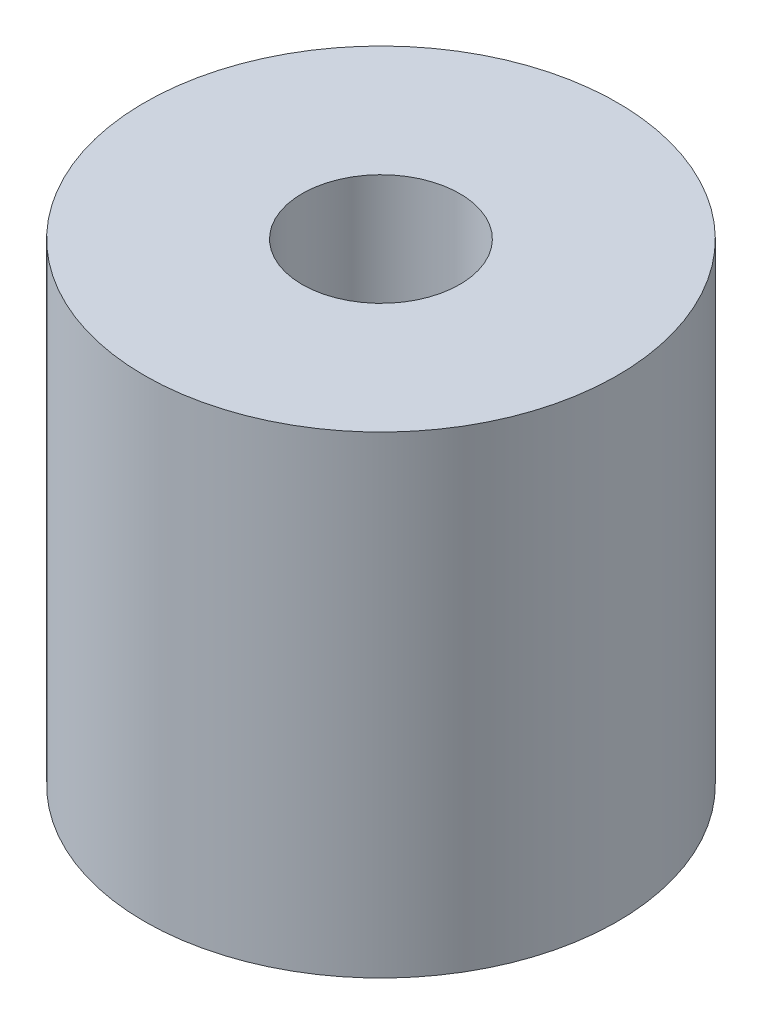
ISO-10303-21;
HEADER;
FILE_DESCRIPTION(('STEP AP214'),'2;1');
FILE_NAME('part.step','',(''),(''),'','','');
FILE_SCHEMA(('AUTOMOTIVE_DESIGN { 1 0 10303 214 1 1 1 1 }'));
ENDSEC;
DATA;
#1=APPLICATION_CONTEXT('core data for automotive mechanical design processes');
#2=APPLICATION_PROTOCOL_DEFINITION('international standard','automotive_design',2000,#1);
#3=PRODUCT_CONTEXT('',#1,'mechanical');
#4=PRODUCT('Part','Part','',(#3));
#5=PRODUCT_RELATED_PRODUCT_CATEGORY('part','',(#4));
#6=PRODUCT_DEFINITION_FORMATION('','',#4);
#7=PRODUCT_DEFINITION_CONTEXT('part definition',#1,'design');
#8=PRODUCT_DEFINITION('design','',#6,#7);
#9=PRODUCT_DEFINITION_SHAPE('','',#8);
#10=(LENGTH_UNIT() NAMED_UNIT(*) SI_UNIT(.MILLI.,.METRE.));
#11=(NAMED_UNIT(*) PLANE_ANGLE_UNIT() SI_UNIT($,.RADIAN.));
#12=(NAMED_UNIT(*) SI_UNIT($,.STERADIAN.) SOLID_ANGLE_UNIT());
#13=UNCERTAINTY_MEASURE_WITH_UNIT(LENGTH_MEASURE(1.E-05),#10,'distance_accuracy_value','');
#14=(GEOMETRIC_REPRESENTATION_CONTEXT(3) GLOBAL_UNCERTAINTY_ASSIGNED_CONTEXT((#13)) GLOBAL_UNIT_ASSIGNED_CONTEXT((#10,
#11,#12)) REPRESENTATION_CONTEXT('',''));
#15=CARTESIAN_POINT('',(0.,0.,0.));
#16=DIRECTION('',(0.,0.,1.));
#17=DIRECTION('',(1.,0.,0.));
#18=AXIS2_PLACEMENT_3D('',#15,#16,#17);
#19=CARTESIAN_POINT('',(0.,12.,0.));
#20=DIRECTION('',(0.,1.,0.));
#21=DIRECTION('',(0.,0.,1.));
#22=AXIS2_PLACEMENT_3D('',#19,#20,#21);
#23=PLANE('',#22);
#24=CARTESIAN_POINT('',(0.,12.,0.));
#25=DIRECTION('',(0.,1.,0.));
#26=DIRECTION('',(0.,0.,1.));
#27=AXIS2_PLACEMENT_3D('',#24,#25,#26);
#28=CIRCLE('',#27,6.);
#29=CARTESIAN_POINT('',(0.,12.,6.));
#30=VERTEX_POINT('',#29);
#31=EDGE_CURVE('E10',#30,#30,#28,.T.);
#32=ORIENTED_EDGE('',*,*,#31,.T.);
#33=EDGE_LOOP('',(#32));
#34=FACE_BOUND('',#33,.T.);
#35=CARTESIAN_POINT('',(0.,12.,0.));
#36=DIRECTION('',(0.,1.,0.));
#37=DIRECTION('',(0.,0.,1.));
#38=AXIS2_PLACEMENT_3D('',#35,#36,#37);
#39=CIRCLE('',#38,2.);
#40=CARTESIAN_POINT('',(0.,12.,2.));
#41=VERTEX_POINT('',#40);
#42=EDGE_CURVE('E42',#41,#41,#39,.T.);
#43=ORIENTED_EDGE('',*,*,#42,.F.);
#44=EDGE_LOOP('',(#43));
#45=FACE_BOUND('',#44,.T.);
#46=ADVANCED_FACE('F31',(#34,#45),#23,.T.);
#47=CARTESIAN_POINT('',(0.,0.,0.));
#48=DIRECTION('',(0.,1.,0.));
#49=DIRECTION('',(0.,0.,1.));
#50=AXIS2_PLACEMENT_3D('',#47,#48,#49);
#51=PLANE('',#50);
#52=CARTESIAN_POINT('',(0.,0.,0.));
#53=DIRECTION('',(0.,1.,0.));
#54=DIRECTION('',(0.,0.,1.));
#55=AXIS2_PLACEMENT_3D('',#52,#53,#54);
#56=CIRCLE('',#55,6.);
#57=CARTESIAN_POINT('',(0.,0.,6.));
#58=VERTEX_POINT('',#57);
#59=EDGE_CURVE('E35',#58,#58,#56,.T.);
#60=ORIENTED_EDGE('',*,*,#59,.F.);
#61=EDGE_LOOP('',(#60));
#62=FACE_BOUND('',#61,.T.);
#63=CARTESIAN_POINT('',(0.,0.,0.));
#64=DIRECTION('',(0.,1.,0.));
#65=DIRECTION('',(0.,0.,1.));
#66=AXIS2_PLACEMENT_3D('',#63,#64,#65);
#67=CIRCLE('',#66,2.);
#68=CARTESIAN_POINT('',(0.,0.,2.));
#69=VERTEX_POINT('',#68);
#70=EDGE_CURVE('E44',#69,#69,#67,.T.);
#71=ORIENTED_EDGE('',*,*,#70,.T.);
#72=EDGE_LOOP('',(#71));
#73=FACE_BOUND('',#72,.T.);
#74=ADVANCED_FACE('F54',(#62,#73),#51,.F.);
#75=CARTESIAN_POINT('',(0.,12.,0.));
#76=DIRECTION('',(0.,-1.,0.));
#77=DIRECTION('',(0.,0.,-1.));
#78=AXIS2_PLACEMENT_3D('',#75,#76,#77);
#79=CYLINDRICAL_SURFACE('',#78,6.);
#80=ORIENTED_EDGE('',*,*,#31,.F.);
#81=EDGE_LOOP('',(#80));
#82=FACE_BOUND('',#81,.T.);
#83=ORIENTED_EDGE('',*,*,#59,.T.);
#84=EDGE_LOOP('',(#83));
#85=FACE_BOUND('',#84,.T.);
#86=ADVANCED_FACE('F33',(#82,#85),#79,.T.);
#87=CARTESIAN_POINT('',(0.,12.,0.));
#88=DIRECTION('',(0.,-1.,0.));
#89=DIRECTION('',(0.,0.,-1.));
#90=AXIS2_PLACEMENT_3D('',#87,#88,#89);
#91=CYLINDRICAL_SURFACE('',#90,2.);
#92=ORIENTED_EDGE('',*,*,#42,.T.);
#93=EDGE_LOOP('',(#92));
#94=FACE_BOUND('',#93,.T.);
#95=ORIENTED_EDGE('',*,*,#70,.F.);
#96=EDGE_LOOP('',(#95));
#97=FACE_BOUND('',#96,.T.);
#98=ADVANCED_FACE('F50',(#94,#97),#91,.F.);
#99=CLOSED_SHELL('',(#46,#74,#86,#98));
#100=MANIFOLD_SOLID_BREP('B2',#99);
#101=ADVANCED_BREP_SHAPE_REPRESENTATION('',(#18,#100),#14);
#102=SHAPE_DEFINITION_REPRESENTATION(#9,#101);
ENDSEC;
END-ISO-10303-21;
